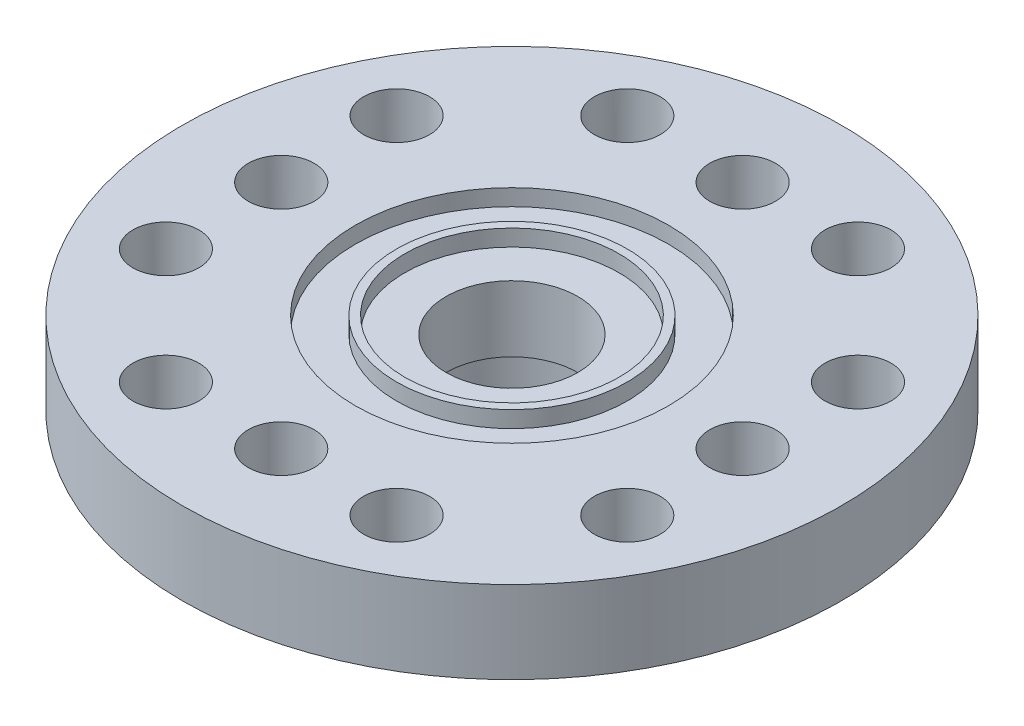
ISO-10303-21;
HEADER;
FILE_DESCRIPTION(('STEP AP214'),'2;1');
FILE_NAME('part.step','',(''),(''),'','','');
FILE_SCHEMA(('AUTOMOTIVE_DESIGN { 1 0 10303 214 1 1 1 1 }'));
ENDSEC;
DATA;
#1=APPLICATION_CONTEXT('core data for automotive mechanical design processes');
#2=APPLICATION_PROTOCOL_DEFINITION('international standard','automotive_design',2000,#1);
#3=PRODUCT_CONTEXT('',#1,'mechanical');
#4=PRODUCT('Part','Part','',(#3));
#5=PRODUCT_RELATED_PRODUCT_CATEGORY('part','',(#4));
#6=PRODUCT_DEFINITION_FORMATION('','',#4);
#7=PRODUCT_DEFINITION_CONTEXT('part definition',#1,'design');
#8=PRODUCT_DEFINITION('design','',#6,#7);
#9=PRODUCT_DEFINITION_SHAPE('','',#8);
#10=(LENGTH_UNIT() NAMED_UNIT(*) SI_UNIT(.MILLI.,.METRE.));
#11=(NAMED_UNIT(*) PLANE_ANGLE_UNIT() SI_UNIT($,.RADIAN.));
#12=(NAMED_UNIT(*) SI_UNIT($,.STERADIAN.) SOLID_ANGLE_UNIT());
#13=UNCERTAINTY_MEASURE_WITH_UNIT(LENGTH_MEASURE(1.E-05),#10,'distance_accuracy_value','');
#14=(GEOMETRIC_REPRESENTATION_CONTEXT(3) GLOBAL_UNCERTAINTY_ASSIGNED_CONTEXT((#13)) GLOBAL_UNIT_ASSIGNED_CONTEXT((#10,
#11,#12)) REPRESENTATION_CONTEXT('',''));
#15=CARTESIAN_POINT('',(0.,0.,0.));
#16=DIRECTION('',(0.,0.,1.));
#17=DIRECTION('',(1.,0.,0.));
#18=AXIS2_PLACEMENT_3D('',#15,#16,#17);
#19=CARTESIAN_POINT('',(0.,-3.,0.));
#20=DIRECTION('',(0.,1.,0.));
#21=DIRECTION('',(0.,0.,1.));
#22=AXIS2_PLACEMENT_3D('',#19,#20,#21);
#23=CYLINDRICAL_SURFACE('',#22,2.);
#24=CARTESIAN_POINT('',(0.,0.,0.));
#25=DIRECTION('',(0.,1.,0.));
#26=DIRECTION('',(0.,0.,1.));
#27=AXIS2_PLACEMENT_3D('',#24,#25,#26);
#28=CIRCLE('',#27,2.);
#29=CARTESIAN_POINT('',(0.,0.,2.));
#30=VERTEX_POINT('',#29);
#31=EDGE_CURVE('E61',#30,#30,#28,.F.);
#32=ORIENTED_EDGE('',*,*,#31,.T.);
#33=EDGE_LOOP('',(#32));
#34=FACE_BOUND('',#33,.T.);
#35=CARTESIAN_POINT('',(0.,2.,0.));
#36=DIRECTION('',(0.,1.,0.));
#37=DIRECTION('',(0.,0.,1.));
#38=AXIS2_PLACEMENT_3D('',#35,#36,#37);
#39=CIRCLE('',#38,2.);
#40=CARTESIAN_POINT('',(0.,2.,2.));
#41=VERTEX_POINT('',#40);
#42=EDGE_CURVE('E115',#41,#41,#39,.F.);
#43=ORIENTED_EDGE('',*,*,#42,.F.);
#44=EDGE_LOOP('',(#43));
#45=FACE_BOUND('',#44,.T.);
#46=ADVANCED_FACE('F40',(#34,#45),#23,.F.);
#47=CARTESIAN_POINT('',(0.,2.5,0.));
#48=DIRECTION('',(0.,-1.,0.));
#49=DIRECTION('',(0.,0.,-1.));
#50=AXIS2_PLACEMENT_3D('',#47,#48,#49);
#51=CYLINDRICAL_SURFACE('',#50,10.);
#52=CARTESIAN_POINT('',(0.,2.5,0.));
#53=DIRECTION('',(0.,1.,0.));
#54=DIRECTION('',(0.,0.,1.));
#55=AXIS2_PLACEMENT_3D('',#52,#53,#54);
#56=CIRCLE('',#55,10.);
#57=CARTESIAN_POINT('',(0.,2.5,10.));
#58=VERTEX_POINT('',#57);
#59=EDGE_CURVE('E48',#58,#58,#56,.T.);
#60=ORIENTED_EDGE('',*,*,#59,.F.);
#61=EDGE_LOOP('',(#60));
#62=FACE_BOUND('',#61,.T.);
#63=CARTESIAN_POINT('',(0.,0.,0.));
#64=DIRECTION('',(0.,1.,0.));
#65=DIRECTION('',(0.,0.,1.));
#66=AXIS2_PLACEMENT_3D('',#63,#64,#65);
#67=CIRCLE('',#66,10.);
#68=CARTESIAN_POINT('',(0.,0.,10.));
#69=VERTEX_POINT('',#68);
#70=EDGE_CURVE('E53',#69,#69,#67,.T.);
#71=ORIENTED_EDGE('',*,*,#70,.T.);
#72=EDGE_LOOP('',(#71));
#73=FACE_BOUND('',#72,.T.);
#74=ADVANCED_FACE('F42',(#62,#73),#51,.T.);
#75=CARTESIAN_POINT('',(0.,2.5,0.));
#76=DIRECTION('',(0.,1.,0.));
#77=DIRECTION('',(0.,0.,1.));
#78=AXIS2_PLACEMENT_3D('',#75,#76,#77);
#79=PLANE('',#78);
#80=CARTESIAN_POINT('',(-7.,2.5,3.5));
#81=DIRECTION('',(0.,1.,0.));
#82=DIRECTION('',(0.,0.,-1.));
#83=AXIS2_PLACEMENT_3D('',#80,#81,#82);
#84=CIRCLE('',#83,1.);
#85=CARTESIAN_POINT('',(-7.,2.5,2.5));
#86=VERTEX_POINT('',#85);
#87=EDGE_CURVE('E373',#86,#86,#84,.T.);
#88=ORIENTED_EDGE('',*,*,#87,.F.);
#89=EDGE_LOOP('',(#88));
#90=FACE_BOUND('',#89,.T.);
#91=CARTESIAN_POINT('',(-7.,2.5,0.));
#92=DIRECTION('',(0.,1.,0.));
#93=DIRECTION('',(0.,0.,-1.));
#94=AXIS2_PLACEMENT_3D('',#91,#92,#93);
#95=CIRCLE('',#94,1.);
#96=CARTESIAN_POINT('',(-7.,2.5,-1.));
#97=VERTEX_POINT('',#96);
#98=EDGE_CURVE('E374',#97,#97,#95,.T.);
#99=ORIENTED_EDGE('',*,*,#98,.F.);
#100=EDGE_LOOP('',(#99));
#101=FACE_BOUND('',#100,.T.);
#102=CARTESIAN_POINT('',(-7.,2.5,-3.5));
#103=DIRECTION('',(0.,1.,0.));
#104=DIRECTION('',(0.,0.,-1.));
#105=AXIS2_PLACEMENT_3D('',#102,#103,#104);
#106=CIRCLE('',#105,1.);
#107=CARTESIAN_POINT('',(-7.,2.5,-4.5));
#108=VERTEX_POINT('',#107);
#109=EDGE_CURVE('E377',#108,#108,#106,.T.);
#110=ORIENTED_EDGE('',*,*,#109,.F.);
#111=EDGE_LOOP('',(#110));
#112=FACE_BOUND('',#111,.T.);
#113=CARTESIAN_POINT('',(-3.5,2.5,7.));
#114=DIRECTION('',(0.,1.,0.));
#115=DIRECTION('',(0.,0.,1.));
#116=AXIS2_PLACEMENT_3D('',#113,#114,#115);
#117=CIRCLE('',#116,1.);
#118=CARTESIAN_POINT('',(-3.5,2.5,8.));
#119=VERTEX_POINT('',#118);
#120=EDGE_CURVE('E381',#119,#119,#117,.T.);
#121=ORIENTED_EDGE('',*,*,#120,.F.);
#122=EDGE_LOOP('',(#121));
#123=FACE_BOUND('',#122,.T.);
#124=CARTESIAN_POINT('',(0.,2.5,7.));
#125=DIRECTION('',(0.,1.,0.));
#126=DIRECTION('',(0.,0.,1.));
#127=AXIS2_PLACEMENT_3D('',#124,#125,#126);
#128=CIRCLE('',#127,1.);
#129=CARTESIAN_POINT('',(0.,2.5,8.));
#130=VERTEX_POINT('',#129);
#131=EDGE_CURVE('E395',#130,#130,#128,.T.);
#132=ORIENTED_EDGE('',*,*,#131,.F.);
#133=EDGE_LOOP('',(#132));
#134=FACE_BOUND('',#133,.T.);
#135=CARTESIAN_POINT('',(7.,2.5,-3.5));
#136=DIRECTION('',(0.,1.,0.));
#137=DIRECTION('',(0.,0.,1.));
#138=AXIS2_PLACEMENT_3D('',#135,#136,#137);
#139=CIRCLE('',#138,1.);
#140=CARTESIAN_POINT('',(7.,2.5,-2.5));
#141=VERTEX_POINT('',#140);
#142=EDGE_CURVE('E399',#141,#141,#139,.T.);
#143=ORIENTED_EDGE('',*,*,#142,.F.);
#144=EDGE_LOOP('',(#143));
#145=FACE_BOUND('',#144,.T.);
#146=CARTESIAN_POINT('',(7.,2.5,0.));
#147=DIRECTION('',(0.,1.,0.));
#148=DIRECTION('',(0.,0.,1.));
#149=AXIS2_PLACEMENT_3D('',#146,#147,#148);
#150=CIRCLE('',#149,1.);
#151=CARTESIAN_POINT('',(7.,2.5,1.));
#152=VERTEX_POINT('',#151);
#153=EDGE_CURVE('E407',#152,#152,#150,.T.);
#154=ORIENTED_EDGE('',*,*,#153,.F.);
#155=EDGE_LOOP('',(#154));
#156=FACE_BOUND('',#155,.T.);
#157=CARTESIAN_POINT('',(3.5,2.5,-7.));
#158=DIRECTION('',(0.,1.,0.));
#159=DIRECTION('',(0.,0.,-1.));
#160=AXIS2_PLACEMENT_3D('',#157,#158,#159);
#161=CIRCLE('',#160,1.);
#162=CARTESIAN_POINT('',(3.5,2.5,-8.));
#163=VERTEX_POINT('',#162);
#164=EDGE_CURVE('E411',#163,#163,#161,.T.);
#165=ORIENTED_EDGE('',*,*,#164,.F.);
#166=EDGE_LOOP('',(#165));
#167=FACE_BOUND('',#166,.T.);
#168=CARTESIAN_POINT('',(0.,2.5,-7.));
#169=DIRECTION('',(0.,1.,0.));
#170=DIRECTION('',(0.,0.,-1.));
#171=AXIS2_PLACEMENT_3D('',#168,#169,#170);
#172=CIRCLE('',#171,1.);
#173=CARTESIAN_POINT('',(0.,2.5,-8.));
#174=VERTEX_POINT('',#173);
#175=EDGE_CURVE('E414',#174,#174,#172,.T.);
#176=ORIENTED_EDGE('',*,*,#175,.F.);
#177=EDGE_LOOP('',(#176));
#178=FACE_BOUND('',#177,.T.);
#179=CARTESIAN_POINT('',(-3.5,2.5,-7.));
#180=DIRECTION('',(0.,1.,0.));
#181=DIRECTION('',(0.,0.,-1.));
#182=AXIS2_PLACEMENT_3D('',#179,#180,#181);
#183=CIRCLE('',#182,1.);
#184=CARTESIAN_POINT('',(-3.5,2.5,-8.));
#185=VERTEX_POINT('',#184);
#186=EDGE_CURVE('E402',#185,#185,#183,.T.);
#187=ORIENTED_EDGE('',*,*,#186,.F.);
#188=EDGE_LOOP('',(#187));
#189=FACE_BOUND('',#188,.T.);
#190=CARTESIAN_POINT('',(7.,2.5,3.5));
#191=DIRECTION('',(0.,1.,0.));
#192=DIRECTION('',(0.,0.,1.));
#193=AXIS2_PLACEMENT_3D('',#190,#191,#192);
#194=CIRCLE('',#193,1.);
#195=CARTESIAN_POINT('',(7.,2.5,4.5));
#196=VERTEX_POINT('',#195);
#197=EDGE_CURVE('E409',#196,#196,#194,.T.);
#198=ORIENTED_EDGE('',*,*,#197,.F.);
#199=EDGE_LOOP('',(#198));
#200=FACE_BOUND('',#199,.T.);
#201=CARTESIAN_POINT('',(3.5,2.5,7.));
#202=DIRECTION('',(0.,1.,0.));
#203=DIRECTION('',(0.,0.,1.));
#204=AXIS2_PLACEMENT_3D('',#201,#202,#203);
#205=CIRCLE('',#204,1.);
#206=CARTESIAN_POINT('',(3.5,2.5,8.));
#207=VERTEX_POINT('',#206);
#208=EDGE_CURVE('E69',#207,#207,#205,.T.);
#209=ORIENTED_EDGE('',*,*,#208,.F.);
#210=EDGE_LOOP('',(#209));
#211=FACE_BOUND('',#210,.T.);
#212=CARTESIAN_POINT('',(0.,2.5,0.));
#213=DIRECTION('',(0.,1.,0.));
#214=DIRECTION('',(0.,0.,1.));
#215=AXIS2_PLACEMENT_3D('',#212,#213,#214);
#216=CIRCLE('',#215,4.75);
#217=CARTESIAN_POINT('',(0.,2.5,4.75));
#218=VERTEX_POINT('',#217);
#219=EDGE_CURVE('E104',#218,#218,#216,.T.);
#220=ORIENTED_EDGE('',*,*,#219,.F.);
#221=EDGE_LOOP('',(#220));
#222=FACE_BOUND('',#221,.T.);
#223=ORIENTED_EDGE('',*,*,#59,.T.);
#224=EDGE_LOOP('',(#223));
#225=FACE_BOUND('',#224,.T.);
#226=ADVANCED_FACE('F152',(#90,#101,#112,#123,#134,#145,#156,#167,#178,#189,#200,#211,#222,
#225),#79,.T.);
#227=CARTESIAN_POINT('',(0.,0.,0.));
#228=DIRECTION('',(0.,1.,0.));
#229=DIRECTION('',(0.,0.,1.));
#230=AXIS2_PLACEMENT_3D('',#227,#228,#229);
#231=PLANE('',#230);
#232=CARTESIAN_POINT('',(-7.,0.,3.5));
#233=DIRECTION('',(0.,1.,0.));
#234=DIRECTION('',(0.,0.,1.));
#235=AXIS2_PLACEMENT_3D('',#232,#233,#234);
#236=CIRCLE('',#235,1.);
#237=CARTESIAN_POINT('',(-7.,0.,4.5));
#238=VERTEX_POINT('',#237);
#239=EDGE_CURVE('E44',#238,#238,#236,.T.);
#240=ORIENTED_EDGE('',*,*,#239,.T.);
#241=EDGE_LOOP('',(#240));
#242=FACE_BOUND('',#241,.T.);
#243=CARTESIAN_POINT('',(-7.,0.,0.));
#244=DIRECTION('',(0.,1.,0.));
#245=DIRECTION('',(0.,0.,1.));
#246=AXIS2_PLACEMENT_3D('',#243,#244,#245);
#247=CIRCLE('',#246,1.);
#248=CARTESIAN_POINT('',(-7.,0.,1.));
#249=VERTEX_POINT('',#248);
#250=EDGE_CURVE('E95',#249,#249,#247,.T.);
#251=ORIENTED_EDGE('',*,*,#250,.T.);
#252=EDGE_LOOP('',(#251));
#253=FACE_BOUND('',#252,.T.);
#254=CARTESIAN_POINT('',(-7.,0.,-3.5));
#255=DIRECTION('',(0.,1.,0.));
#256=DIRECTION('',(0.,0.,1.));
#257=AXIS2_PLACEMENT_3D('',#254,#255,#256);
#258=CIRCLE('',#257,1.);
#259=CARTESIAN_POINT('',(-7.,0.,-2.5));
#260=VERTEX_POINT('',#259);
#261=EDGE_CURVE('E93',#260,#260,#258,.T.);
#262=ORIENTED_EDGE('',*,*,#261,.T.);
#263=EDGE_LOOP('',(#262));
#264=FACE_BOUND('',#263,.T.);
#265=CARTESIAN_POINT('',(-3.5,0.,7.));
#266=DIRECTION('',(0.,1.,0.));
#267=DIRECTION('',(0.,0.,1.));
#268=AXIS2_PLACEMENT_3D('',#265,#266,#267);
#269=CIRCLE('',#268,1.);
#270=CARTESIAN_POINT('',(-3.5,0.,8.));
#271=VERTEX_POINT('',#270);
#272=EDGE_CURVE('E90',#271,#271,#269,.T.);
#273=ORIENTED_EDGE('',*,*,#272,.T.);
#274=EDGE_LOOP('',(#273));
#275=FACE_BOUND('',#274,.T.);
#276=CARTESIAN_POINT('',(0.,0.,7.));
#277=DIRECTION('',(0.,1.,0.));
#278=DIRECTION('',(0.,0.,1.));
#279=AXIS2_PLACEMENT_3D('',#276,#277,#278);
#280=CIRCLE('',#279,1.);
#281=CARTESIAN_POINT('',(0.,0.,8.));
#282=VERTEX_POINT('',#281);
#283=EDGE_CURVE('E87',#282,#282,#280,.T.);
#284=ORIENTED_EDGE('',*,*,#283,.T.);
#285=EDGE_LOOP('',(#284));
#286=FACE_BOUND('',#285,.T.);
#287=CARTESIAN_POINT('',(7.,0.,-3.5));
#288=DIRECTION('',(0.,1.,0.));
#289=DIRECTION('',(0.,0.,1.));
#290=AXIS2_PLACEMENT_3D('',#287,#288,#289);
#291=CIRCLE('',#290,1.);
#292=CARTESIAN_POINT('',(7.,0.,-2.5));
#293=VERTEX_POINT('',#292);
#294=EDGE_CURVE('E84',#293,#293,#291,.T.);
#295=ORIENTED_EDGE('',*,*,#294,.T.);
#296=EDGE_LOOP('',(#295));
#297=FACE_BOUND('',#296,.T.);
#298=CARTESIAN_POINT('',(7.,0.,0.));
#299=DIRECTION('',(0.,1.,0.));
#300=DIRECTION('',(0.,0.,1.));
#301=AXIS2_PLACEMENT_3D('',#298,#299,#300);
#302=CIRCLE('',#301,1.);
#303=CARTESIAN_POINT('',(7.,0.,1.));
#304=VERTEX_POINT('',#303);
#305=EDGE_CURVE('E81',#304,#304,#302,.T.);
#306=ORIENTED_EDGE('',*,*,#305,.T.);
#307=EDGE_LOOP('',(#306));
#308=FACE_BOUND('',#307,.T.);
#309=CARTESIAN_POINT('',(3.5,0.,-7.));
#310=DIRECTION('',(0.,1.,0.));
#311=DIRECTION('',(0.,0.,1.));
#312=AXIS2_PLACEMENT_3D('',#309,#310,#311);
#313=CIRCLE('',#312,1.);
#314=CARTESIAN_POINT('',(3.5,0.,-6.));
#315=VERTEX_POINT('',#314);
#316=EDGE_CURVE('E78',#315,#315,#313,.T.);
#317=ORIENTED_EDGE('',*,*,#316,.T.);
#318=EDGE_LOOP('',(#317));
#319=FACE_BOUND('',#318,.T.);
#320=CARTESIAN_POINT('',(0.,0.,-7.));
#321=DIRECTION('',(0.,1.,0.));
#322=DIRECTION('',(0.,0.,1.));
#323=AXIS2_PLACEMENT_3D('',#320,#321,#322);
#324=CIRCLE('',#323,1.);
#325=CARTESIAN_POINT('',(0.,0.,-6.));
#326=VERTEX_POINT('',#325);
#327=EDGE_CURVE('E75',#326,#326,#324,.T.);
#328=ORIENTED_EDGE('',*,*,#327,.T.);
#329=EDGE_LOOP('',(#328));
#330=FACE_BOUND('',#329,.T.);
#331=CARTESIAN_POINT('',(-3.5,0.,-7.));
#332=DIRECTION('',(0.,1.,0.));
#333=DIRECTION('',(0.,0.,1.));
#334=AXIS2_PLACEMENT_3D('',#331,#332,#333);
#335=CIRCLE('',#334,1.);
#336=CARTESIAN_POINT('',(-3.5,0.,-6.));
#337=VERTEX_POINT('',#336);
#338=EDGE_CURVE('E72',#337,#337,#335,.T.);
#339=ORIENTED_EDGE('',*,*,#338,.T.);
#340=EDGE_LOOP('',(#339));
#341=FACE_BOUND('',#340,.T.);
#342=CARTESIAN_POINT('',(7.,0.,3.5));
#343=DIRECTION('',(0.,1.,0.));
#344=DIRECTION('',(0.,0.,1.));
#345=AXIS2_PLACEMENT_3D('',#342,#343,#344);
#346=CIRCLE('',#345,1.);
#347=CARTESIAN_POINT('',(7.,0.,4.5));
#348=VERTEX_POINT('',#347);
#349=EDGE_CURVE('E68',#348,#348,#346,.T.);
#350=ORIENTED_EDGE('',*,*,#349,.T.);
#351=EDGE_LOOP('',(#350));
#352=FACE_BOUND('',#351,.T.);
#353=CARTESIAN_POINT('',(3.5,0.,7.));
#354=DIRECTION('',(0.,1.,0.));
#355=DIRECTION('',(0.,0.,1.));
#356=AXIS2_PLACEMENT_3D('',#353,#354,#355);
#357=CIRCLE('',#356,1.);
#358=CARTESIAN_POINT('',(3.5,0.,8.));
#359=VERTEX_POINT('',#358);
#360=EDGE_CURVE('E65',#359,#359,#357,.T.);
#361=ORIENTED_EDGE('',*,*,#360,.T.);
#362=EDGE_LOOP('',(#361));
#363=FACE_BOUND('',#362,.T.);
#364=CARTESIAN_POINT('',(0.,0.,0.));
#365=DIRECTION('',(0.,-1.,0.));
#366=DIRECTION('',(0.,0.,-1.));
#367=AXIS2_PLACEMENT_3D('',#364,#365,#366);
#368=CIRCLE('',#367,4.5);
#369=CARTESIAN_POINT('',(0.,0.,-4.5));
#370=VERTEX_POINT('',#369);
#371=EDGE_CURVE('E12',#370,#370,#368,.T.);
#372=ORIENTED_EDGE('',*,*,#371,.F.);
#373=EDGE_LOOP('',(#372));
#374=FACE_BOUND('',#373,.T.);
#375=ORIENTED_EDGE('',*,*,#70,.F.);
#376=EDGE_LOOP('',(#375));
#377=FACE_BOUND('',#376,.T.);
#378=ADVANCED_FACE('F162',(#242,#253,#264,#275,#286,#297,#308,#319,#330,#341,#352,#363,#374,
#377),#231,.F.);
#379=CARTESIAN_POINT('',(0.,-3.,0.));
#380=DIRECTION('',(0.,1.,0.));
#381=DIRECTION('',(0.,0.,1.));
#382=AXIS2_PLACEMENT_3D('',#379,#380,#381);
#383=CYLINDRICAL_SURFACE('',#382,4.5);
#384=CARTESIAN_POINT('',(0.,-3.,0.));
#385=DIRECTION('',(0.,-1.,0.));
#386=DIRECTION('',(0.,0.,-1.));
#387=AXIS2_PLACEMENT_3D('',#384,#385,#386);
#388=CIRCLE('',#387,4.5);
#389=CARTESIAN_POINT('',(0.,-3.,-4.5));
#390=VERTEX_POINT('',#389);
#391=EDGE_CURVE('E56',#390,#390,#388,.T.);
#392=ORIENTED_EDGE('',*,*,#391,.F.);
#393=EDGE_LOOP('',(#392));
#394=FACE_BOUND('',#393,.T.);
#395=ORIENTED_EDGE('',*,*,#371,.T.);
#396=EDGE_LOOP('',(#395));
#397=FACE_BOUND('',#396,.T.);
#398=ADVANCED_FACE('F158',(#394,#397),#383,.T.);
#399=CARTESIAN_POINT('',(0.,-3.,0.));
#400=DIRECTION('',(0.,-1.,0.));
#401=DIRECTION('',(0.,0.,-1.));
#402=AXIS2_PLACEMENT_3D('',#399,#400,#401);
#403=PLANE('',#402);
#404=CARTESIAN_POINT('',(0.,-3.,0.));
#405=DIRECTION('',(0.,-1.,0.));
#406=DIRECTION('',(0.,0.,-1.));
#407=AXIS2_PLACEMENT_3D('',#404,#405,#406);
#408=CIRCLE('',#407,2.5);
#409=CARTESIAN_POINT('',(0.,-3.,-2.5));
#410=VERTEX_POINT('',#409);
#411=EDGE_CURVE('E122',#410,#410,#408,.T.);
#412=ORIENTED_EDGE('',*,*,#411,.F.);
#413=EDGE_LOOP('',(#412));
#414=FACE_BOUND('',#413,.T.);
#415=ORIENTED_EDGE('',*,*,#391,.T.);
#416=EDGE_LOOP('',(#415));
#417=FACE_BOUND('',#416,.T.);
#418=ADVANCED_FACE('F144',(#414,#417),#403,.T.);
#419=CARTESIAN_POINT('',(0.,0.,0.));
#420=DIRECTION('',(0.,1.,0.));
#421=DIRECTION('',(0.,0.,1.));
#422=AXIS2_PLACEMENT_3D('',#419,#420,#421);
#423=PLANE('',#422);
#424=CARTESIAN_POINT('',(0.,0.,0.));
#425=DIRECTION('',(0.,1.,0.));
#426=DIRECTION('',(0.,0.,1.));
#427=AXIS2_PLACEMENT_3D('',#424,#425,#426);
#428=CIRCLE('',#427,2.5);
#429=CARTESIAN_POINT('',(0.,0.,2.5));
#430=VERTEX_POINT('',#429);
#431=EDGE_CURVE('E64',#430,#430,#428,.F.);
#432=ORIENTED_EDGE('',*,*,#431,.T.);
#433=EDGE_LOOP('',(#432));
#434=FACE_BOUND('',#433,.T.);
#435=ORIENTED_EDGE('',*,*,#31,.F.);
#436=EDGE_LOOP('',(#435));
#437=FACE_BOUND('',#436,.T.);
#438=ADVANCED_FACE('F129',(#434,#437),#423,.F.);
#439=CARTESIAN_POINT('',(0.,9.57106781186548,0.));
#440=DIRECTION('',(0.,-1.,0.));
#441=DIRECTION('',(0.,0.,-1.));
#442=AXIS2_PLACEMENT_3D('',#439,#440,#441);
#443=CYLINDRICAL_SURFACE('',#442,2.5);
#444=ORIENTED_EDGE('',*,*,#411,.T.);
#445=EDGE_LOOP('',(#444));
#446=FACE_BOUND('',#445,.T.);
#447=ORIENTED_EDGE('',*,*,#431,.F.);
#448=EDGE_LOOP('',(#447));
#449=FACE_BOUND('',#448,.T.);
#450=ADVANCED_FACE('F132',(#446,#449),#443,.F.);
#451=CARTESIAN_POINT('',(0.,2.,0.));
#452=DIRECTION('',(0.,1.,0.));
#453=DIRECTION('',(0.,0.,1.));
#454=AXIS2_PLACEMENT_3D('',#451,#452,#453);
#455=CYLINDRICAL_SURFACE('',#454,3.25);
#456=CARTESIAN_POINT('',(0.,2.,0.));
#457=DIRECTION('',(0.,1.,0.));
#458=DIRECTION('',(0.,0.,1.));
#459=AXIS2_PLACEMENT_3D('',#456,#457,#458);
#460=CIRCLE('',#459,3.25);
#461=CARTESIAN_POINT('',(0.,2.,3.25));
#462=VERTEX_POINT('',#461);
#463=EDGE_CURVE('E118',#462,#462,#460,.T.);
#464=ORIENTED_EDGE('',*,*,#463,.F.);
#465=EDGE_LOOP('',(#464));
#466=FACE_BOUND('',#465,.T.);
#467=CARTESIAN_POINT('',(0.,2.5,0.));
#468=DIRECTION('',(0.,1.,0.));
#469=DIRECTION('',(0.,0.,1.));
#470=AXIS2_PLACEMENT_3D('',#467,#468,#469);
#471=CIRCLE('',#470,3.25);
#472=CARTESIAN_POINT('',(0.,2.5,3.25));
#473=VERTEX_POINT('',#472);
#474=EDGE_CURVE('E119',#473,#473,#471,.T.);
#475=ORIENTED_EDGE('',*,*,#474,.T.);
#476=EDGE_LOOP('',(#475));
#477=FACE_BOUND('',#476,.T.);
#478=ADVANCED_FACE('F134',(#466,#477),#455,.F.);
#479=CARTESIAN_POINT('',(0.,2.,0.));
#480=DIRECTION('',(0.,1.,0.));
#481=DIRECTION('',(0.,0.,1.));
#482=AXIS2_PLACEMENT_3D('',#479,#480,#481);
#483=PLANE('',#482);
#484=ORIENTED_EDGE('',*,*,#42,.T.);
#485=EDGE_LOOP('',(#484));
#486=FACE_BOUND('',#485,.T.);
#487=ORIENTED_EDGE('',*,*,#463,.T.);
#488=EDGE_LOOP('',(#487));
#489=FACE_BOUND('',#488,.T.);
#490=ADVANCED_FACE('F141',(#486,#489),#483,.T.);
#491=ORIENTED_EDGE('',*,*,#474,.F.);
#492=EDGE_LOOP('',(#491));
#493=FACE_BOUND('',#492,.T.);
#494=CARTESIAN_POINT('',(0.,2.5,0.));
#495=DIRECTION('',(0.,1.,0.));
#496=DIRECTION('',(0.,0.,1.));
#497=AXIS2_PLACEMENT_3D('',#494,#495,#496);
#498=CIRCLE('',#497,3.5);
#499=CARTESIAN_POINT('',(0.,2.5,3.5));
#500=VERTEX_POINT('',#499);
#501=EDGE_CURVE('E100',#500,#500,#498,.T.);
#502=ORIENTED_EDGE('',*,*,#501,.T.);
#503=EDGE_LOOP('',(#502));
#504=FACE_BOUND('',#503,.T.);
#505=ADVANCED_FACE('F166',(#493,#504),#79,.T.);
#506=CARTESIAN_POINT('',(0.,2.,0.));
#507=DIRECTION('',(0.,1.,0.));
#508=DIRECTION('',(0.,0.,1.));
#509=AXIS2_PLACEMENT_3D('',#506,#507,#508);
#510=CYLINDRICAL_SURFACE('',#509,3.5);
#511=CARTESIAN_POINT('',(0.,2.,0.));
#512=DIRECTION('',(0.,1.,0.));
#513=DIRECTION('',(0.,0.,1.));
#514=AXIS2_PLACEMENT_3D('',#511,#512,#513);
#515=CIRCLE('',#514,3.5);
#516=CARTESIAN_POINT('',(0.,2.,3.5));
#517=VERTEX_POINT('',#516);
#518=EDGE_CURVE('E109',#517,#517,#515,.T.);
#519=ORIENTED_EDGE('',*,*,#518,.T.);
#520=EDGE_LOOP('',(#519));
#521=FACE_BOUND('',#520,.T.);
#522=ORIENTED_EDGE('',*,*,#501,.F.);
#523=EDGE_LOOP('',(#522));
#524=FACE_BOUND('',#523,.T.);
#525=ADVANCED_FACE('F218',(#521,#524),#510,.T.);
#526=CARTESIAN_POINT('',(0.,2.,0.));
#527=DIRECTION('',(0.,1.,0.));
#528=DIRECTION('',(0.,0.,1.));
#529=AXIS2_PLACEMENT_3D('',#526,#527,#528);
#530=CYLINDRICAL_SURFACE('',#529,4.75);
#531=CARTESIAN_POINT('',(0.,2.,0.));
#532=DIRECTION('',(0.,1.,0.));
#533=DIRECTION('',(0.,0.,1.));
#534=AXIS2_PLACEMENT_3D('',#531,#532,#533);
#535=CIRCLE('',#534,4.75);
#536=CARTESIAN_POINT('',(0.,2.,4.75));
#537=VERTEX_POINT('',#536);
#538=EDGE_CURVE('E112',#537,#537,#535,.T.);
#539=ORIENTED_EDGE('',*,*,#538,.F.);
#540=EDGE_LOOP('',(#539));
#541=FACE_BOUND('',#540,.T.);
#542=ORIENTED_EDGE('',*,*,#219,.T.);
#543=EDGE_LOOP('',(#542));
#544=FACE_BOUND('',#543,.T.);
#545=ADVANCED_FACE('F208',(#541,#544),#530,.F.);
#546=CARTESIAN_POINT('',(0.,2.,0.));
#547=DIRECTION('',(0.,1.,0.));
#548=DIRECTION('',(0.,0.,1.));
#549=AXIS2_PLACEMENT_3D('',#546,#547,#548);
#550=PLANE('',#549);
#551=ORIENTED_EDGE('',*,*,#518,.F.);
#552=EDGE_LOOP('',(#551));
#553=FACE_BOUND('',#552,.T.);
#554=ORIENTED_EDGE('',*,*,#538,.T.);
#555=EDGE_LOOP('',(#554));
#556=FACE_BOUND('',#555,.T.);
#557=ADVANCED_FACE('F198',(#553,#556),#550,.T.);
#558=CARTESIAN_POINT('',(3.5,-3.,7.));
#559=DIRECTION('',(0.,1.,0.));
#560=DIRECTION('',(0.,0.,1.));
#561=AXIS2_PLACEMENT_3D('',#558,#559,#560);
#562=CYLINDRICAL_SURFACE('',#561,1.);
#563=ORIENTED_EDGE('',*,*,#208,.T.);
#564=EDGE_LOOP('',(#563));
#565=FACE_BOUND('',#564,.T.);
#566=ORIENTED_EDGE('',*,*,#360,.F.);
#567=EDGE_LOOP('',(#566));
#568=FACE_BOUND('',#567,.T.);
#569=ADVANCED_FACE('F195',(#565,#568),#562,.F.);
#570=CARTESIAN_POINT('',(7.,-3.,3.5));
#571=DIRECTION('',(0.,1.,0.));
#572=DIRECTION('',(0.,0.,1.));
#573=AXIS2_PLACEMENT_3D('',#570,#571,#572);
#574=CYLINDRICAL_SURFACE('',#573,1.);
#575=ORIENTED_EDGE('',*,*,#197,.T.);
#576=EDGE_LOOP('',(#575));
#577=FACE_BOUND('',#576,.T.);
#578=ORIENTED_EDGE('',*,*,#349,.F.);
#579=EDGE_LOOP('',(#578));
#580=FACE_BOUND('',#579,.T.);
#581=ADVANCED_FACE('F197',(#577,#580),#574,.F.);
#582=CARTESIAN_POINT('',(-3.5,-3.,-7.));
#583=DIRECTION('',(0.,1.,0.));
#584=DIRECTION('',(0.,0.,1.));
#585=AXIS2_PLACEMENT_3D('',#582,#583,#584);
#586=CYLINDRICAL_SURFACE('',#585,1.);
#587=ORIENTED_EDGE('',*,*,#186,.T.);
#588=EDGE_LOOP('',(#587));
#589=FACE_BOUND('',#588,.T.);
#590=ORIENTED_EDGE('',*,*,#338,.F.);
#591=EDGE_LOOP('',(#590));
#592=FACE_BOUND('',#591,.T.);
#593=ADVANCED_FACE('F205',(#589,#592),#586,.F.);
#594=CARTESIAN_POINT('',(0.,-3.,-7.));
#595=DIRECTION('',(0.,1.,0.));
#596=DIRECTION('',(0.,0.,1.));
#597=AXIS2_PLACEMENT_3D('',#594,#595,#596);
#598=CYLINDRICAL_SURFACE('',#597,1.);
#599=ORIENTED_EDGE('',*,*,#175,.T.);
#600=EDGE_LOOP('',(#599));
#601=FACE_BOUND('',#600,.T.);
#602=ORIENTED_EDGE('',*,*,#327,.F.);
#603=EDGE_LOOP('',(#602));
#604=FACE_BOUND('',#603,.T.);
#605=ADVANCED_FACE('F279',(#601,#604),#598,.F.);
#606=CARTESIAN_POINT('',(3.5,-3.,-7.));
#607=DIRECTION('',(0.,1.,0.));
#608=DIRECTION('',(0.,0.,1.));
#609=AXIS2_PLACEMENT_3D('',#606,#607,#608);
#610=CYLINDRICAL_SURFACE('',#609,1.);
#611=ORIENTED_EDGE('',*,*,#164,.T.);
#612=EDGE_LOOP('',(#611));
#613=FACE_BOUND('',#612,.T.);
#614=ORIENTED_EDGE('',*,*,#316,.F.);
#615=EDGE_LOOP('',(#614));
#616=FACE_BOUND('',#615,.T.);
#617=ADVANCED_FACE('F289',(#613,#616),#610,.F.);
#618=CARTESIAN_POINT('',(7.,-3.,0.));
#619=DIRECTION('',(0.,1.,0.));
#620=DIRECTION('',(0.,0.,1.));
#621=AXIS2_PLACEMENT_3D('',#618,#619,#620);
#622=CYLINDRICAL_SURFACE('',#621,1.);
#623=ORIENTED_EDGE('',*,*,#153,.T.);
#624=EDGE_LOOP('',(#623));
#625=FACE_BOUND('',#624,.T.);
#626=ORIENTED_EDGE('',*,*,#305,.F.);
#627=EDGE_LOOP('',(#626));
#628=FACE_BOUND('',#627,.T.);
#629=ADVANCED_FACE('F299',(#625,#628),#622,.F.);
#630=CARTESIAN_POINT('',(7.,-3.,-3.5));
#631=DIRECTION('',(0.,1.,0.));
#632=DIRECTION('',(0.,0.,1.));
#633=AXIS2_PLACEMENT_3D('',#630,#631,#632);
#634=CYLINDRICAL_SURFACE('',#633,1.);
#635=ORIENTED_EDGE('',*,*,#142,.T.);
#636=EDGE_LOOP('',(#635));
#637=FACE_BOUND('',#636,.T.);
#638=ORIENTED_EDGE('',*,*,#294,.F.);
#639=EDGE_LOOP('',(#638));
#640=FACE_BOUND('',#639,.T.);
#641=ADVANCED_FACE('F309',(#637,#640),#634,.F.);
#642=CARTESIAN_POINT('',(0.,-3.,7.));
#643=DIRECTION('',(0.,1.,0.));
#644=DIRECTION('',(0.,0.,1.));
#645=AXIS2_PLACEMENT_3D('',#642,#643,#644);
#646=CYLINDRICAL_SURFACE('',#645,1.);
#647=ORIENTED_EDGE('',*,*,#131,.T.);
#648=EDGE_LOOP('',(#647));
#649=FACE_BOUND('',#648,.T.);
#650=ORIENTED_EDGE('',*,*,#283,.F.);
#651=EDGE_LOOP('',(#650));
#652=FACE_BOUND('',#651,.T.);
#653=ADVANCED_FACE('F319',(#649,#652),#646,.F.);
#654=CARTESIAN_POINT('',(-3.5,-3.,7.));
#655=DIRECTION('',(0.,1.,0.));
#656=DIRECTION('',(0.,0.,1.));
#657=AXIS2_PLACEMENT_3D('',#654,#655,#656);
#658=CYLINDRICAL_SURFACE('',#657,1.);
#659=ORIENTED_EDGE('',*,*,#120,.T.);
#660=EDGE_LOOP('',(#659));
#661=FACE_BOUND('',#660,.T.);
#662=ORIENTED_EDGE('',*,*,#272,.F.);
#663=EDGE_LOOP('',(#662));
#664=FACE_BOUND('',#663,.T.);
#665=ADVANCED_FACE('F329',(#661,#664),#658,.F.);
#666=CARTESIAN_POINT('',(-7.,-3.,-3.5));
#667=DIRECTION('',(0.,1.,0.));
#668=DIRECTION('',(0.,0.,1.));
#669=AXIS2_PLACEMENT_3D('',#666,#667,#668);
#670=CYLINDRICAL_SURFACE('',#669,1.);
#671=ORIENTED_EDGE('',*,*,#109,.T.);
#672=EDGE_LOOP('',(#671));
#673=FACE_BOUND('',#672,.T.);
#674=ORIENTED_EDGE('',*,*,#261,.F.);
#675=EDGE_LOOP('',(#674));
#676=FACE_BOUND('',#675,.T.);
#677=ADVANCED_FACE('F339',(#673,#676),#670,.F.);
#678=CARTESIAN_POINT('',(-7.,-3.,0.));
#679=DIRECTION('',(0.,1.,0.));
#680=DIRECTION('',(0.,0.,1.));
#681=AXIS2_PLACEMENT_3D('',#678,#679,#680);
#682=CYLINDRICAL_SURFACE('',#681,1.);
#683=ORIENTED_EDGE('',*,*,#98,.T.);
#684=EDGE_LOOP('',(#683));
#685=FACE_BOUND('',#684,.T.);
#686=ORIENTED_EDGE('',*,*,#250,.F.);
#687=EDGE_LOOP('',(#686));
#688=FACE_BOUND('',#687,.T.);
#689=ADVANCED_FACE('F349',(#685,#688),#682,.F.);
#690=CARTESIAN_POINT('',(-7.,-3.,3.5));
#691=DIRECTION('',(0.,1.,0.));
#692=DIRECTION('',(0.,0.,1.));
#693=AXIS2_PLACEMENT_3D('',#690,#691,#692);
#694=CYLINDRICAL_SURFACE('',#693,1.);
#695=ORIENTED_EDGE('',*,*,#87,.T.);
#696=EDGE_LOOP('',(#695));
#697=FACE_BOUND('',#696,.T.);
#698=ORIENTED_EDGE('',*,*,#239,.F.);
#699=EDGE_LOOP('',(#698));
#700=FACE_BOUND('',#699,.T.);
#701=ADVANCED_FACE('F213',(#697,#700),#694,.F.);
#702=CLOSED_SHELL('',(#46,#74,#226,#378,#398,#418,#438,#450,#478,#490,#505,#525,#545,#557,#569,
#581,#593,#605,#617,#629,#641,#653,#665,#677,#689,#701));
#703=MANIFOLD_SOLID_BREP('B2',#702);
#704=ADVANCED_BREP_SHAPE_REPRESENTATION('',(#18,#703),#14);
#705=SHAPE_DEFINITION_REPRESENTATION(#9,#704);
ENDSEC;
END-ISO-10303-21;
